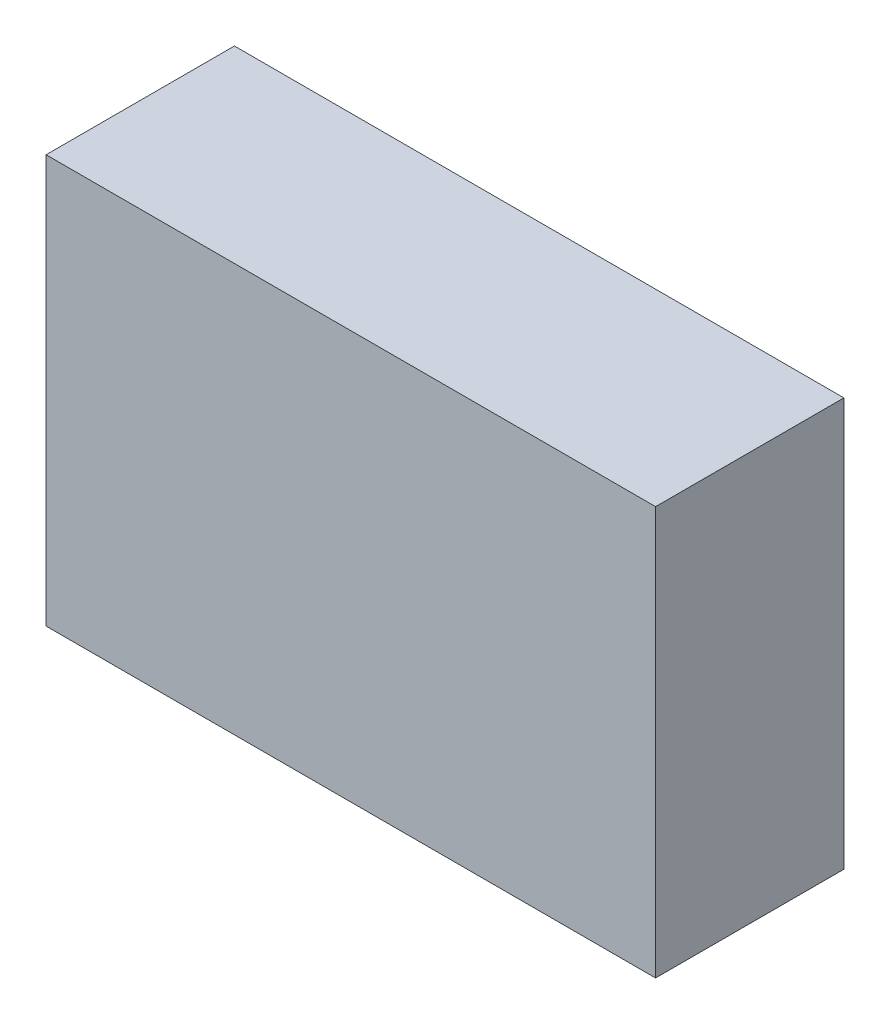
ISO-10303-21;
HEADER;
FILE_DESCRIPTION(('STEP AP214'),'2;1');
FILE_NAME('part.step','',(''),(''),'','','');
FILE_SCHEMA(('AUTOMOTIVE_DESIGN { 1 0 10303 214 1 1 1 1 }'));
ENDSEC;
DATA;
#1=APPLICATION_CONTEXT('core data for automotive mechanical design processes');
#2=APPLICATION_PROTOCOL_DEFINITION('international standard','automotive_design',2000,#1);
#3=PRODUCT_CONTEXT('',#1,'mechanical');
#4=PRODUCT('Part','Part','',(#3));
#5=PRODUCT_RELATED_PRODUCT_CATEGORY('part','',(#4));
#6=PRODUCT_DEFINITION_FORMATION('','',#4);
#7=PRODUCT_DEFINITION_CONTEXT('part definition',#1,'design');
#8=PRODUCT_DEFINITION('design','',#6,#7);
#9=PRODUCT_DEFINITION_SHAPE('','',#8);
#10=(LENGTH_UNIT() NAMED_UNIT(*) SI_UNIT(.MILLI.,.METRE.));
#11=(NAMED_UNIT(*) PLANE_ANGLE_UNIT() SI_UNIT($,.RADIAN.));
#12=(NAMED_UNIT(*) SI_UNIT($,.STERADIAN.) SOLID_ANGLE_UNIT());
#13=UNCERTAINTY_MEASURE_WITH_UNIT(LENGTH_MEASURE(1.E-05),#10,'distance_accuracy_value','');
#14=(GEOMETRIC_REPRESENTATION_CONTEXT(3) GLOBAL_UNCERTAINTY_ASSIGNED_CONTEXT((#13)) GLOBAL_UNIT_ASSIGNED_CONTEXT((#10,
#11,#12)) REPRESENTATION_CONTEXT('',''));
#15=CARTESIAN_POINT('',(0.,0.,0.));
#16=DIRECTION('',(0.,0.,1.));
#17=DIRECTION('',(1.,0.,0.));
#18=AXIS2_PLACEMENT_3D('',#15,#16,#17);
#19=CARTESIAN_POINT('',(0.,0.,23.3));
#20=DIRECTION('',(1.,0.,0.));
#21=DIRECTION('',(0.,0.,-1.));
#22=AXIS2_PLACEMENT_3D('',#19,#20,#21);
#23=PLANE('',#22);
#24=DIRECTION('',(0.,-1.,0.));
#25=VECTOR('',#24,1.);
#26=CARTESIAN_POINT('',(0.,0.,0.));
#27=LINE('',#26,#25);
#28=CARTESIAN_POINT('',(0.,50.5,0.));
#29=VERTEX_POINT('',#28);
#30=CARTESIAN_POINT('',(0.,0.,0.));
#31=VERTEX_POINT('',#30);
#32=EDGE_CURVE('E107',#29,#31,#27,.T.);
#33=ORIENTED_EDGE('',*,*,#32,.T.);
#34=DIRECTION('',(0.,0.,-1.));
#35=VECTOR('',#34,1.);
#36=CARTESIAN_POINT('',(0.,0.,23.3));
#37=LINE('',#36,#35);
#38=CARTESIAN_POINT('',(0.,0.,23.3));
#39=VERTEX_POINT('',#38);
#40=EDGE_CURVE('E11',#39,#31,#37,.T.);
#41=ORIENTED_EDGE('',*,*,#40,.F.);
#42=DIRECTION('',(0.,-1.,0.));
#43=VECTOR('',#42,1.);
#44=CARTESIAN_POINT('',(0.,0.,23.3));
#45=LINE('',#44,#43);
#46=CARTESIAN_POINT('',(0.,50.5,23.3));
#47=VERTEX_POINT('',#46);
#48=EDGE_CURVE('E91',#47,#39,#45,.T.);
#49=ORIENTED_EDGE('',*,*,#48,.F.);
#50=DIRECTION('',(0.,0.,-1.));
#51=VECTOR('',#50,1.);
#52=CARTESIAN_POINT('',(0.,50.5,23.3));
#53=LINE('',#52,#51);
#54=EDGE_CURVE('E103',#47,#29,#53,.T.);
#55=ORIENTED_EDGE('',*,*,#54,.T.);
#56=EDGE_LOOP('',(#33,#41,#49,#55));
#57=FACE_BOUND('',#56,.T.);
#58=ADVANCED_FACE('F39',(#57),#23,.F.);
#59=CARTESIAN_POINT('',(0.,0.,23.3));
#60=DIRECTION('',(0.,1.,0.));
#61=DIRECTION('',(0.,0.,1.));
#62=AXIS2_PLACEMENT_3D('',#59,#60,#61);
#63=PLANE('',#62);
#64=DIRECTION('',(1.,0.,0.));
#65=VECTOR('',#64,1.);
#66=CARTESIAN_POINT('',(0.,0.,0.));
#67=LINE('',#66,#65);
#68=CARTESIAN_POINT('',(75.4,0.,0.));
#69=VERTEX_POINT('',#68);
#70=EDGE_CURVE('E96',#31,#69,#67,.T.);
#71=ORIENTED_EDGE('',*,*,#70,.T.);
#72=DIRECTION('',(0.,0.,-1.));
#73=VECTOR('',#72,1.);
#74=CARTESIAN_POINT('',(75.4,0.,23.3));
#75=LINE('',#74,#73);
#76=CARTESIAN_POINT('',(75.4,0.,23.3));
#77=VERTEX_POINT('',#76);
#78=EDGE_CURVE('E48',#77,#69,#75,.T.);
#79=ORIENTED_EDGE('',*,*,#78,.F.);
#80=DIRECTION('',(1.,0.,0.));
#81=VECTOR('',#80,1.);
#82=CARTESIAN_POINT('',(0.,0.,23.3));
#83=LINE('',#82,#81);
#84=EDGE_CURVE('E86',#39,#77,#83,.T.);
#85=ORIENTED_EDGE('',*,*,#84,.F.);
#86=ORIENTED_EDGE('',*,*,#40,.T.);
#87=EDGE_LOOP('',(#71,#79,#85,#86));
#88=FACE_BOUND('',#87,.T.);
#89=ADVANCED_FACE('F95',(#88),#63,.F.);
#90=CARTESIAN_POINT('',(75.4,0.,23.3));
#91=DIRECTION('',(-1.,0.,0.));
#92=DIRECTION('',(0.,0.,1.));
#93=AXIS2_PLACEMENT_3D('',#90,#91,#92);
#94=PLANE('',#93);
#95=DIRECTION('',(0.,1.,0.));
#96=VECTOR('',#95,1.);
#97=CARTESIAN_POINT('',(75.4,0.,0.));
#98=LINE('',#97,#96);
#99=CARTESIAN_POINT('',(75.4,50.5,0.));
#100=VERTEX_POINT('',#99);
#101=EDGE_CURVE('E73',#69,#100,#98,.T.);
#102=ORIENTED_EDGE('',*,*,#101,.T.);
#103=DIRECTION('',(0.,0.,-1.));
#104=VECTOR('',#103,1.);
#105=CARTESIAN_POINT('',(75.4,50.5,23.3));
#106=LINE('',#105,#104);
#107=CARTESIAN_POINT('',(75.4,50.5,23.3));
#108=VERTEX_POINT('',#107);
#109=EDGE_CURVE('E98',#108,#100,#106,.T.);
#110=ORIENTED_EDGE('',*,*,#109,.F.);
#111=DIRECTION('',(0.,1.,0.));
#112=VECTOR('',#111,1.);
#113=CARTESIAN_POINT('',(75.4,0.,23.3));
#114=LINE('',#113,#112);
#115=EDGE_CURVE('E89',#77,#108,#114,.T.);
#116=ORIENTED_EDGE('',*,*,#115,.F.);
#117=ORIENTED_EDGE('',*,*,#78,.T.);
#118=EDGE_LOOP('',(#102,#110,#116,#117));
#119=FACE_BOUND('',#118,.T.);
#120=ADVANCED_FACE('F99',(#119),#94,.F.);
#121=CARTESIAN_POINT('',(0.,50.5,23.3));
#122=DIRECTION('',(0.,-1.,0.));
#123=DIRECTION('',(0.,0.,-1.));
#124=AXIS2_PLACEMENT_3D('',#121,#122,#123);
#125=PLANE('',#124);
#126=DIRECTION('',(-1.,0.,0.));
#127=VECTOR('',#126,1.);
#128=CARTESIAN_POINT('',(0.,50.5,0.));
#129=LINE('',#128,#127);
#130=EDGE_CURVE('E79',#100,#29,#129,.T.);
#131=ORIENTED_EDGE('',*,*,#130,.T.);
#132=ORIENTED_EDGE('',*,*,#54,.F.);
#133=DIRECTION('',(-1.,0.,0.));
#134=VECTOR('',#133,1.);
#135=CARTESIAN_POINT('',(0.,50.5,23.3));
#136=LINE('',#135,#134);
#137=EDGE_CURVE('E56',#108,#47,#136,.T.);
#138=ORIENTED_EDGE('',*,*,#137,.F.);
#139=ORIENTED_EDGE('',*,*,#109,.T.);
#140=EDGE_LOOP('',(#131,#132,#138,#139));
#141=FACE_BOUND('',#140,.T.);
#142=ADVANCED_FACE('F120',(#141),#125,.F.);
#143=CARTESIAN_POINT('',(0.,0.,23.3));
#144=DIRECTION('',(0.,0.,-1.));
#145=DIRECTION('',(-1.,0.,0.));
#146=AXIS2_PLACEMENT_3D('',#143,#144,#145);
#147=PLANE('',#146);
#148=ORIENTED_EDGE('',*,*,#48,.T.);
#149=ORIENTED_EDGE('',*,*,#84,.T.);
#150=ORIENTED_EDGE('',*,*,#115,.T.);
#151=ORIENTED_EDGE('',*,*,#137,.T.);
#152=EDGE_LOOP('',(#148,#149,#150,#151));
#153=FACE_BOUND('',#152,.T.);
#154=ADVANCED_FACE('F87',(#153),#147,.F.);
#155=CARTESIAN_POINT('',(0.,0.,0.));
#156=DIRECTION('',(0.,0.,-1.));
#157=DIRECTION('',(-1.,0.,0.));
#158=AXIS2_PLACEMENT_3D('',#155,#156,#157);
#159=PLANE('',#158);
#160=ORIENTED_EDGE('',*,*,#32,.F.);
#161=ORIENTED_EDGE('',*,*,#130,.F.);
#162=ORIENTED_EDGE('',*,*,#101,.F.);
#163=ORIENTED_EDGE('',*,*,#70,.F.);
#164=EDGE_LOOP('',(#160,#161,#162,#163));
#165=FACE_BOUND('',#164,.T.);
#166=ADVANCED_FACE('F123',(#165),#159,.T.);
#167=CLOSED_SHELL('',(#58,#89,#120,#142,#154,#166));
#168=MANIFOLD_SOLID_BREP('B2',#167);
#169=ADVANCED_BREP_SHAPE_REPRESENTATION('',(#18,#168),#14);
#170=SHAPE_DEFINITION_REPRESENTATION(#9,#169);
ENDSEC;
END-ISO-10303-21;
